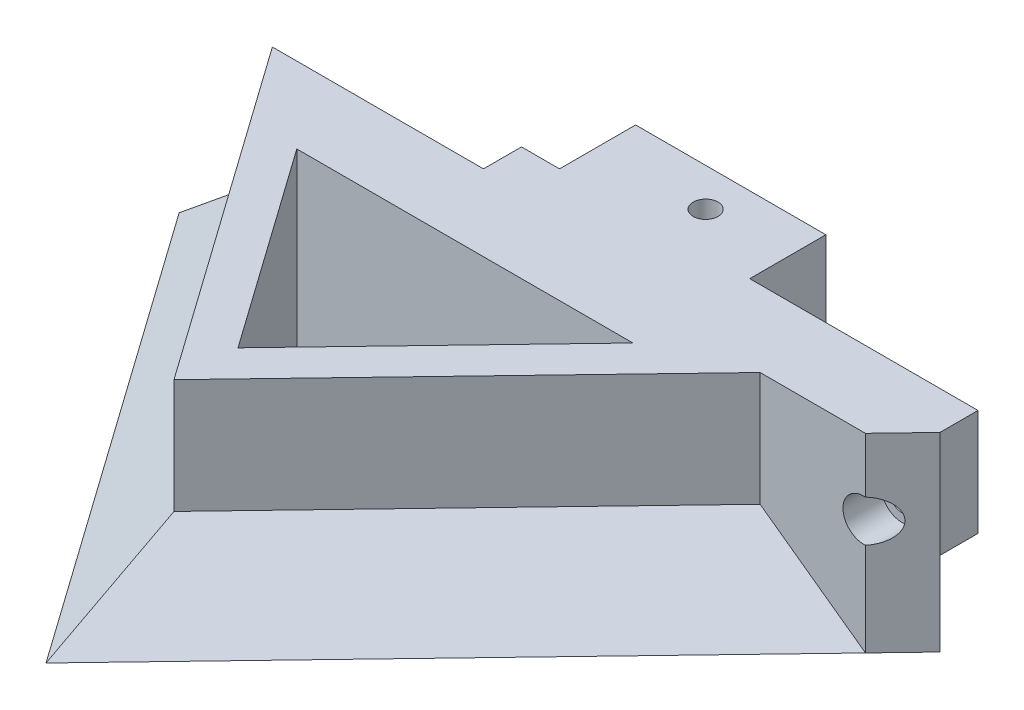
ISO-10303-21;
HEADER;
FILE_DESCRIPTION(('STEP AP214'),'2;1');
FILE_NAME('part.step','',(''),(''),'','','');
FILE_SCHEMA(('AUTOMOTIVE_DESIGN { 1 0 10303 214 1 1 1 1 }'));
ENDSEC;
DATA;
#1=APPLICATION_CONTEXT('core data for automotive mechanical design processes');
#2=APPLICATION_PROTOCOL_DEFINITION('international standard','automotive_design',2000,#1);
#3=PRODUCT_CONTEXT('',#1,'mechanical');
#4=PRODUCT('Part','Part','',(#3));
#5=PRODUCT_RELATED_PRODUCT_CATEGORY('part','',(#4));
#6=PRODUCT_DEFINITION_FORMATION('','',#4);
#7=PRODUCT_DEFINITION_CONTEXT('part definition',#1,'design');
#8=PRODUCT_DEFINITION('design','',#6,#7);
#9=PRODUCT_DEFINITION_SHAPE('','',#8);
#10=(LENGTH_UNIT() NAMED_UNIT(*) SI_UNIT(.MILLI.,.METRE.));
#11=(NAMED_UNIT(*) PLANE_ANGLE_UNIT() SI_UNIT($,.RADIAN.));
#12=(NAMED_UNIT(*) SI_UNIT($,.STERADIAN.) SOLID_ANGLE_UNIT());
#13=UNCERTAINTY_MEASURE_WITH_UNIT(LENGTH_MEASURE(1.E-05),#10,'distance_accuracy_value','');
#14=(GEOMETRIC_REPRESENTATION_CONTEXT(3) GLOBAL_UNCERTAINTY_ASSIGNED_CONTEXT((#13)) GLOBAL_UNIT_ASSIGNED_CONTEXT((#10,
#11,#12)) REPRESENTATION_CONTEXT('',''));
#15=CARTESIAN_POINT('',(0.,0.,0.));
#16=DIRECTION('',(0.,0.,1.));
#17=DIRECTION('',(1.,0.,0.));
#18=AXIS2_PLACEMENT_3D('',#15,#16,#17);
#19=CARTESIAN_POINT('',(-6.35,19.05,19.05));
#20=DIRECTION('',(0.,0.,-1.));
#21=DIRECTION('',(-1.,0.,0.));
#22=AXIS2_PLACEMENT_3D('',#19,#20,#21);
#23=CYLINDRICAL_SURFACE('',#22,3.4925);
#24=CARTESIAN_POINT('',(-6.35,19.05,6.35000000000001));
#25=DIRECTION('',(0.,0.,-1.));
#26=DIRECTION('',(-1.,0.,0.));
#27=AXIS2_PLACEMENT_3D('',#24,#25,#26);
#28=CIRCLE('',#27,3.4925);
#29=CARTESIAN_POINT('',(-6.08541666666669,15.5675365171014,6.35000000000001));
#30=VERTEX_POINT('',#29);
#31=CARTESIAN_POINT('',(-6.08541666666669,22.5324634828986,6.35000000000001));
#32=VERTEX_POINT('',#31);
#33=EDGE_CURVE('E43',#30,#32,#28,.T.);
#34=ORIENTED_EDGE('',*,*,#33,.F.);
#35=CARTESIAN_POINT('',(-6.35,19.05,6.62608695652175));
#36=DIRECTION('',(-0.721988205115424,0.,-0.691905363235615));
#37=DIRECTION('',(0.691905363235615,0.,-0.721988205115424));
#38=AXIS2_PLACEMENT_3D('',#35,#36,#37);
#39=ELLIPSE('',#38,5.04765562687321,3.4925);
#40=EDGE_CURVE('E57',#32,#30,#39,.T.);
#41=ORIENTED_EDGE('',*,*,#40,.F.);
#42=EDGE_LOOP('',(#34,#41));
#43=FACE_BOUND('',#42,.T.);
#44=CARTESIAN_POINT('',(-6.35,19.05,0.));
#45=DIRECTION('',(0.,0.,-1.));
#46=DIRECTION('',(-1.,0.,0.));
#47=AXIS2_PLACEMENT_3D('',#44,#45,#46);
#48=CIRCLE('',#47,3.4925);
#49=CARTESIAN_POINT('',(-9.84250000000001,19.05,0.));
#50=VERTEX_POINT('',#49);
#51=EDGE_CURVE('E11',#50,#50,#48,.F.);
#52=ORIENTED_EDGE('',*,*,#51,.F.);
#53=EDGE_LOOP('',(#52));
#54=FACE_BOUND('',#53,.T.);
#55=ADVANCED_FACE('F35',(#43,#54),#23,.F.);
#56=CARTESIAN_POINT('',(-51.816,31.75,-12.7));
#57=DIRECTION('',(0.,-1.,0.));
#58=DIRECTION('',(0.,0.,-1.));
#59=AXIS2_PLACEMENT_3D('',#56,#57,#58);
#60=CYLINDRICAL_SURFACE('',#59,2.0828);
#61=CARTESIAN_POINT('',(-51.816,31.75,-12.7));
#62=DIRECTION('',(0.,1.,0.));
#63=DIRECTION('',(0.,0.,1.));
#64=AXIS2_PLACEMENT_3D('',#61,#62,#63);
#65=CIRCLE('',#64,2.0828);
#66=CARTESIAN_POINT('',(-51.816,31.75,-10.6172));
#67=VERTEX_POINT('',#66);
#68=EDGE_CURVE('E268',#67,#67,#65,.T.);
#69=ORIENTED_EDGE('',*,*,#68,.T.);
#70=EDGE_LOOP('',(#69));
#71=FACE_BOUND('',#70,.T.);
#72=CARTESIAN_POINT('',(-51.816,25.4,-12.7));
#73=DIRECTION('',(0.,-1.,0.));
#74=DIRECTION('',(0.,0.,-1.));
#75=AXIS2_PLACEMENT_3D('',#72,#73,#74);
#76=CIRCLE('',#75,2.0828);
#77=CARTESIAN_POINT('',(-51.816,25.4,-14.7828));
#78=VERTEX_POINT('',#77);
#79=EDGE_CURVE('E230',#78,#78,#76,.T.);
#80=ORIENTED_EDGE('',*,*,#79,.T.);
#81=EDGE_LOOP('',(#80));
#82=FACE_BOUND('',#81,.T.);
#83=ADVANCED_FACE('F394',(#71,#82),#60,.F.);
#84=CARTESIAN_POINT('',(-38.1,31.75,-19.05));
#85=DIRECTION('',(-1.,0.,0.));
#86=DIRECTION('',(0.,0.,1.));
#87=AXIS2_PLACEMENT_3D('',#84,#85,#86);
#88=PLANE('',#87);
#89=DIRECTION('',(0.,0.,1.));
#90=VECTOR('',#89,1.);
#91=CARTESIAN_POINT('',(-38.1,19.05,-19.05));
#92=LINE('',#91,#90);
#93=CARTESIAN_POINT('',(-38.1,19.05,-19.05));
#94=VERTEX_POINT('',#93);
#95=CARTESIAN_POINT('',(-38.1,19.05,-6.35));
#96=VERTEX_POINT('',#95);
#97=EDGE_CURVE('E233',#94,#96,#92,.T.);
#98=ORIENTED_EDGE('',*,*,#97,.F.);
#99=DIRECTION('',(0.,-1.,0.));
#100=VECTOR('',#99,1.);
#101=CARTESIAN_POINT('',(-38.1,31.75,-19.05));
#102=LINE('',#101,#100);
#103=CARTESIAN_POINT('',(-38.1,31.75,-19.05));
#104=VERTEX_POINT('',#103);
#105=EDGE_CURVE('E220',#104,#94,#102,.T.);
#106=ORIENTED_EDGE('',*,*,#105,.F.);
#107=DIRECTION('',(0.,0.,-1.));
#108=VECTOR('',#107,1.);
#109=CARTESIAN_POINT('',(-38.1,31.75,-19.05));
#110=LINE('',#109,#108);
#111=CARTESIAN_POINT('',(-38.1,31.75,-6.35));
#112=VERTEX_POINT('',#111);
#113=EDGE_CURVE('E299',#112,#104,#110,.T.);
#114=ORIENTED_EDGE('',*,*,#113,.F.);
#115=DIRECTION('',(0.,-1.,0.));
#116=VECTOR('',#115,1.);
#117=CARTESIAN_POINT('',(-38.1,31.75,-6.35));
#118=LINE('',#117,#116);
#119=EDGE_CURVE('E223',#112,#96,#118,.T.);
#120=ORIENTED_EDGE('',*,*,#119,.T.);
#121=EDGE_LOOP('',(#98,#106,#114,#120));
#122=FACE_BOUND('',#121,.T.);
#123=ADVANCED_FACE('F399',(#122),#88,.F.);
#124=CARTESIAN_POINT('',(-69.85,31.75,-19.05));
#125=DIRECTION('',(0.,0.,1.));
#126=DIRECTION('',(1.,0.,0.));
#127=AXIS2_PLACEMENT_3D('',#124,#125,#126);
#128=PLANE('',#127);
#129=DIRECTION('',(1.,0.,0.));
#130=VECTOR('',#129,1.);
#131=CARTESIAN_POINT('',(-69.85,19.05,-19.05));
#132=LINE('',#131,#130);
#133=CARTESIAN_POINT('',(-69.85,19.05,-19.05));
#134=VERTEX_POINT('',#133);
#135=EDGE_CURVE('E266',#134,#94,#132,.T.);
#136=ORIENTED_EDGE('',*,*,#135,.F.);
#137=DIRECTION('',(0.,-1.,0.));
#138=VECTOR('',#137,1.);
#139=CARTESIAN_POINT('',(-69.85,31.75,-19.05));
#140=LINE('',#139,#138);
#141=CARTESIAN_POINT('',(-69.85,31.75,-19.05));
#142=VERTEX_POINT('',#141);
#143=EDGE_CURVE('E217',#142,#134,#140,.T.);
#144=ORIENTED_EDGE('',*,*,#143,.F.);
#145=DIRECTION('',(-1.,0.,0.));
#146=VECTOR('',#145,1.);
#147=CARTESIAN_POINT('',(-69.85,31.75,-19.05));
#148=LINE('',#147,#146);
#149=EDGE_CURVE('E301',#104,#142,#148,.T.);
#150=ORIENTED_EDGE('',*,*,#149,.F.);
#151=ORIENTED_EDGE('',*,*,#105,.T.);
#152=EDGE_LOOP('',(#136,#144,#150,#151));
#153=FACE_BOUND('',#152,.T.);
#154=ADVANCED_FACE('F451',(#153),#128,.F.);
#155=CARTESIAN_POINT('',(-69.85,31.75,-6.35));
#156=DIRECTION('',(1.,0.,0.));
#157=DIRECTION('',(0.,0.,-1.));
#158=AXIS2_PLACEMENT_3D('',#155,#156,#157);
#159=PLANE('',#158);
#160=DIRECTION('',(0.,0.,-1.));
#161=VECTOR('',#160,1.);
#162=CARTESIAN_POINT('',(-69.85,19.05,-6.35));
#163=LINE('',#162,#161);
#164=CARTESIAN_POINT('',(-69.85,19.05,-6.35));
#165=VERTEX_POINT('',#164);
#166=EDGE_CURVE('E264',#165,#134,#163,.T.);
#167=ORIENTED_EDGE('',*,*,#166,.F.);
#168=DIRECTION('',(0.,-1.,0.));
#169=VECTOR('',#168,1.);
#170=CARTESIAN_POINT('',(-69.85,31.75,-6.35));
#171=LINE('',#170,#169);
#172=CARTESIAN_POINT('',(-69.85,31.75,-6.35));
#173=VERTEX_POINT('',#172);
#174=EDGE_CURVE('E214',#173,#165,#171,.T.);
#175=ORIENTED_EDGE('',*,*,#174,.F.);
#176=DIRECTION('',(0.,0.,1.));
#177=VECTOR('',#176,1.);
#178=CARTESIAN_POINT('',(-69.85,31.75,-6.35));
#179=LINE('',#178,#177);
#180=EDGE_CURVE('E303',#142,#173,#179,.T.);
#181=ORIENTED_EDGE('',*,*,#180,.F.);
#182=ORIENTED_EDGE('',*,*,#143,.T.);
#183=EDGE_LOOP('',(#167,#175,#181,#182));
#184=FACE_BOUND('',#183,.T.);
#185=ADVANCED_FACE('F436',(#184),#159,.F.);
#186=CARTESIAN_POINT('',(0.,31.75,0.));
#187=DIRECTION('',(0.,-1.,0.));
#188=DIRECTION('',(0.,0.,-1.));
#189=AXIS2_PLACEMENT_3D('',#186,#187,#188);
#190=PLANE('',#189);
#191=DIRECTION('',(-1.,0.,0.));
#192=VECTOR('',#191,1.);
#193=CARTESIAN_POINT('',(-76.2,31.75,0.));
#194=LINE('',#193,#192);
#195=CARTESIAN_POINT('',(-76.2,31.75,0.));
#196=VERTEX_POINT('',#195);
#197=CARTESIAN_POINT('',(-111.436741428573,31.75,0.));
#198=VERTEX_POINT('',#197);
#199=EDGE_CURVE('E309',#196,#198,#194,.T.);
#200=ORIENTED_EDGE('',*,*,#199,.T.);
#201=DIRECTION('',(-0.578017340780339,0.,-0.816024481101655));
#202=VECTOR('',#201,1.);
#203=CARTESIAN_POINT('',(-71.5520102233513,31.75,56.3078558191359));
#204=LINE('',#203,#202);
#205=CARTESIAN_POINT('',(-71.5520102233513,31.75,56.3078558191359));
#206=VERTEX_POINT('',#205);
#207=EDGE_CURVE('E334',#206,#198,#204,.T.);
#208=ORIENTED_EDGE('',*,*,#207,.F.);
#209=DIRECTION('',(-0.691905363235615,0.,0.721988205115424));
#210=VECTOR('',#209,1.);
#211=CARTESIAN_POINT('',(-71.5520102233513,31.75,56.3078558191359));
#212=LINE('',#211,#210);
#213=CARTESIAN_POINT('',(-23.6757317300127,31.75,6.35));
#214=VERTEX_POINT('',#213);
#215=EDGE_CURVE('E338',#214,#206,#212,.T.);
#216=ORIENTED_EDGE('',*,*,#215,.F.);
#217=DIRECTION('',(-1.,0.,0.));
#218=VECTOR('',#217,1.);
#219=CARTESIAN_POINT('',(-23.6757317300127,31.75,6.35));
#220=LINE('',#219,#218);
#221=CARTESIAN_POINT('',(-6.08541666666669,31.75,6.35000000000001));
#222=VERTEX_POINT('',#221);
#223=EDGE_CURVE('E340',#222,#214,#220,.T.);
#224=ORIENTED_EDGE('',*,*,#223,.F.);
#225=DIRECTION('',(0.691905363235615,0.,-0.721988205115424));
#226=VECTOR('',#225,1.);
#227=CARTESIAN_POINT('',(-73.025,31.75,76.2));
#228=LINE('',#227,#226);
#229=CARTESIAN_POINT('',(0.,31.75,0.));
#230=VERTEX_POINT('',#229);
#231=EDGE_CURVE('E208',#222,#230,#228,.T.);
#232=ORIENTED_EDGE('',*,*,#231,.T.);
#233=DIRECTION('',(0.,0.,-1.));
#234=VECTOR('',#233,1.);
#235=CARTESIAN_POINT('',(0.,31.75,0.));
#236=LINE('',#235,#234);
#237=CARTESIAN_POINT('',(0.,31.75,-6.35));
#238=VERTEX_POINT('',#237);
#239=EDGE_CURVE('E199',#230,#238,#236,.T.);
#240=ORIENTED_EDGE('',*,*,#239,.T.);
#241=DIRECTION('',(-1.,0.,0.));
#242=VECTOR('',#241,1.);
#243=CARTESIAN_POINT('',(-38.1,31.75,-6.35));
#244=LINE('',#243,#242);
#245=EDGE_CURVE('E297',#238,#112,#244,.T.);
#246=ORIENTED_EDGE('',*,*,#245,.T.);
#247=ORIENTED_EDGE('',*,*,#113,.T.);
#248=ORIENTED_EDGE('',*,*,#149,.T.);
#249=ORIENTED_EDGE('',*,*,#180,.T.);
#250=DIRECTION('',(-1.,0.,0.));
#251=VECTOR('',#250,1.);
#252=CARTESIAN_POINT('',(-69.85,31.75,-6.35));
#253=LINE('',#252,#251);
#254=CARTESIAN_POINT('',(-76.2,31.75,-6.35));
#255=VERTEX_POINT('',#254);
#256=EDGE_CURVE('E305',#173,#255,#253,.T.);
#257=ORIENTED_EDGE('',*,*,#256,.T.);
#258=DIRECTION('',(0.,0.,1.));
#259=VECTOR('',#258,1.);
#260=CARTESIAN_POINT('',(-76.2,31.75,-6.35));
#261=LINE('',#260,#259);
#262=EDGE_CURVE('E307',#255,#196,#261,.T.);
#263=ORIENTED_EDGE('',*,*,#262,.T.);
#264=EDGE_LOOP('',(#200,#208,#216,#224,#232,#240,#246,#247,#248,#249,#257,#263));
#265=FACE_BOUND('',#264,.T.);
#266=DIRECTION('',(0.578017340780339,0.,0.816024481101655));
#267=VECTOR('',#266,1.);
#268=CARTESIAN_POINT('',(-94.6592788095254,31.75,12.7));
#269=LINE('',#268,#267);
#270=CARTESIAN_POINT('',(-94.6592788095254,31.75,12.7));
#271=VERTEX_POINT('',#270);
#272=CARTESIAN_POINT('',(-70.8155153350269,31.75,46.3617837287039));
#273=VERTEX_POINT('',#272);
#274=EDGE_CURVE('E274',#271,#273,#269,.T.);
#275=ORIENTED_EDGE('',*,*,#274,.F.);
#276=DIRECTION('',(-1.,0.,0.));
#277=VECTOR('',#276,1.);
#278=CARTESIAN_POINT('',(-76.2,31.75,12.7));
#279=LINE('',#278,#277);
#280=CARTESIAN_POINT('',(-38.5563059283524,31.75,12.7));
#281=VERTEX_POINT('',#280);
#282=EDGE_CURVE('E272',#281,#271,#279,.T.);
#283=ORIENTED_EDGE('',*,*,#282,.F.);
#284=DIRECTION('',(0.691905363235615,0.,-0.721988205115424));
#285=VECTOR('',#284,1.);
#286=CARTESIAN_POINT('',(-70.8155153350269,31.75,46.3617837287039));
#287=LINE('',#286,#285);
#288=EDGE_CURVE('E277',#273,#281,#287,.T.);
#289=ORIENTED_EDGE('',*,*,#288,.F.);
#290=EDGE_LOOP('',(#275,#283,#289));
#291=FACE_BOUND('',#290,.T.);
#292=ORIENTED_EDGE('',*,*,#68,.F.);
#293=EDGE_LOOP('',(#292));
#294=FACE_BOUND('',#293,.T.);
#295=ADVANCED_FACE('F376',(#265,#291,#294),#190,.F.);
#296=CARTESIAN_POINT('',(0.,0.,0.));
#297=DIRECTION('',(0.,-1.,0.));
#298=DIRECTION('',(0.,0.,-1.));
#299=AXIS2_PLACEMENT_3D('',#296,#297,#298);
#300=PLANE('',#299);
#301=DIRECTION('',(0.,0.,-1.));
#302=VECTOR('',#301,1.);
#303=CARTESIAN_POINT('',(-11.43,0.,0.));
#304=LINE('',#303,#302);
#305=CARTESIAN_POINT('',(-11.43,0.,0.));
#306=VERTEX_POINT('',#305);
#307=CARTESIAN_POINT('',(-11.43,0.,-6.35000000000001));
#308=VERTEX_POINT('',#307);
#309=EDGE_CURVE('E188',#306,#308,#304,.T.);
#310=ORIENTED_EDGE('',*,*,#309,.F.);
#311=DIRECTION('',(-1.,0.,0.));
#312=VECTOR('',#311,1.);
#313=CARTESIAN_POINT('',(0.,0.,0.));
#314=LINE('',#313,#312);
#315=CARTESIAN_POINT('',(0.,0.,0.));
#316=VERTEX_POINT('',#315);
#317=EDGE_CURVE('E172',#316,#306,#314,.T.);
#318=ORIENTED_EDGE('',*,*,#317,.F.);
#319=DIRECTION('',(0.691905363235615,0.,-0.721988205115424));
#320=VECTOR('',#319,1.);
#321=CARTESIAN_POINT('',(-73.025,0.,76.2));
#322=LINE('',#321,#320);
#323=CARTESIAN_POINT('',(-6.0854166666667,0.,6.35000000000005));
#324=VERTEX_POINT('',#323);
#325=EDGE_CURVE('E185',#324,#316,#322,.T.);
#326=ORIENTED_EDGE('',*,*,#325,.F.);
#327=CARTESIAN_POINT('',(-73.025,0.,76.2));
#328=VERTEX_POINT('',#327);
#329=EDGE_CURVE('E196',#328,#324,#322,.T.);
#330=ORIENTED_EDGE('',*,*,#329,.F.);
#331=DIRECTION('',(0.578017340780339,0.,0.816024481101655));
#332=VECTOR('',#331,1.);
#333=CARTESIAN_POINT('',(-127.,0.,0.));
#334=LINE('',#333,#332);
#335=CARTESIAN_POINT('',(-127.,0.,0.));
#336=VERTEX_POINT('',#335);
#337=EDGE_CURVE('E197',#336,#328,#334,.T.);
#338=ORIENTED_EDGE('',*,*,#337,.F.);
#339=DIRECTION('',(-1.,0.,0.));
#340=VECTOR('',#339,1.);
#341=CARTESIAN_POINT('',(-76.2,0.,0.));
#342=LINE('',#341,#340);
#343=CARTESIAN_POINT('',(-76.2,0.,0.));
#344=VERTEX_POINT('',#343);
#345=EDGE_CURVE('E201',#344,#336,#342,.T.);
#346=ORIENTED_EDGE('',*,*,#345,.F.);
#347=DIRECTION('',(0.,0.,1.));
#348=VECTOR('',#347,1.);
#349=CARTESIAN_POINT('',(-76.2,0.,-6.35));
#350=LINE('',#349,#348);
#351=CARTESIAN_POINT('',(-76.2,0.,-6.35));
#352=VERTEX_POINT('',#351);
#353=EDGE_CURVE('E314',#352,#344,#350,.T.);
#354=ORIENTED_EDGE('',*,*,#353,.F.);
#355=DIRECTION('',(-1.,0.,0.));
#356=VECTOR('',#355,1.);
#357=CARTESIAN_POINT('',(-69.85,0.,-6.35));
#358=LINE('',#357,#356);
#359=EDGE_CURVE('E294',#308,#352,#358,.T.);
#360=ORIENTED_EDGE('',*,*,#359,.F.);
#361=EDGE_LOOP('',(#310,#318,#326,#330,#338,#346,#354,#360));
#362=FACE_BOUND('',#361,.T.);
#363=DIRECTION('',(-1.,0.,0.));
#364=VECTOR('',#363,1.);
#365=CARTESIAN_POINT('',(-38.5563059283524,0.,12.7));
#366=LINE('',#365,#364);
#367=CARTESIAN_POINT('',(-38.5563059283524,0.,12.7));
#368=VERTEX_POINT('',#367);
#369=CARTESIAN_POINT('',(-94.6592788095254,0.,12.7));
#370=VERTEX_POINT('',#369);
#371=EDGE_CURVE('E275',#368,#370,#366,.T.);
#372=ORIENTED_EDGE('',*,*,#371,.T.);
#373=DIRECTION('',(0.578017340780339,0.,0.816024481101655));
#374=VECTOR('',#373,1.);
#375=CARTESIAN_POINT('',(-94.6592788095254,0.,12.7));
#376=LINE('',#375,#374);
#377=CARTESIAN_POINT('',(-70.8155153350269,0.,46.3617837287039));
#378=VERTEX_POINT('',#377);
#379=EDGE_CURVE('E271',#370,#378,#376,.T.);
#380=ORIENTED_EDGE('',*,*,#379,.T.);
#381=DIRECTION('',(0.691905363235615,0.,-0.721988205115424));
#382=VECTOR('',#381,1.);
#383=CARTESIAN_POINT('',(-70.8155153350269,0.,46.3617837287039));
#384=LINE('',#383,#382);
#385=EDGE_CURVE('E283',#378,#368,#384,.T.);
#386=ORIENTED_EDGE('',*,*,#385,.T.);
#387=EDGE_LOOP('',(#372,#380,#386));
#388=FACE_BOUND('',#387,.T.);
#389=ADVANCED_FACE('F182',(#362,#388),#300,.T.);
#390=CARTESIAN_POINT('',(0.,31.75,0.));
#391=DIRECTION('',(-1.,0.,0.));
#392=DIRECTION('',(0.,0.,1.));
#393=AXIS2_PLACEMENT_3D('',#390,#391,#392);
#394=PLANE('',#393);
#395=DIRECTION('',(0.,-1.,0.));
#396=VECTOR('',#395,1.);
#397=CARTESIAN_POINT('',(0.,31.75,0.));
#398=LINE('',#397,#396);
#399=CARTESIAN_POINT('',(0.,13.97,0.));
#400=VERTEX_POINT('',#399);
#401=EDGE_CURVE('E205',#230,#400,#398,.T.);
#402=ORIENTED_EDGE('',*,*,#401,.T.);
#403=DIRECTION('',(0.,0.,-1.));
#404=VECTOR('',#403,1.);
#405=CARTESIAN_POINT('',(0.,13.97,0.));
#406=LINE('',#405,#404);
#407=CARTESIAN_POINT('',(0.,13.97,-6.35000000000001));
#408=VERTEX_POINT('',#407);
#409=EDGE_CURVE('E348',#400,#408,#406,.T.);
#410=ORIENTED_EDGE('',*,*,#409,.T.);
#411=DIRECTION('',(0.,-1.,0.));
#412=VECTOR('',#411,1.);
#413=CARTESIAN_POINT('',(0.,31.75,-6.35));
#414=LINE('',#413,#412);
#415=EDGE_CURVE('E226',#238,#408,#414,.T.);
#416=ORIENTED_EDGE('',*,*,#415,.F.);
#417=ORIENTED_EDGE('',*,*,#239,.F.);
#418=EDGE_LOOP('',(#402,#410,#416,#417));
#419=FACE_BOUND('',#418,.T.);
#420=ADVANCED_FACE('F367',(#419),#394,.F.);
#421=CARTESIAN_POINT('',(-69.85,31.75,-6.35));
#422=DIRECTION('',(0.,0.,1.));
#423=DIRECTION('',(1.,0.,0.));
#424=AXIS2_PLACEMENT_3D('',#421,#422,#423);
#425=PLANE('',#424);
#426=ORIENTED_EDGE('',*,*,#415,.T.);
#427=DIRECTION('',(1.,0.,0.));
#428=VECTOR('',#427,1.);
#429=CARTESIAN_POINT('',(-11.43,13.97,-6.35000000000001));
#430=LINE('',#429,#428);
#431=CARTESIAN_POINT('',(-11.43,13.97,-6.35000000000001));
#432=VERTEX_POINT('',#431);
#433=EDGE_CURVE('E178',#432,#408,#430,.T.);
#434=ORIENTED_EDGE('',*,*,#433,.F.);
#435=DIRECTION('',(0.,1.,0.));
#436=VECTOR('',#435,1.);
#437=CARTESIAN_POINT('',(-11.43,0.,-6.35000000000001));
#438=LINE('',#437,#436);
#439=EDGE_CURVE('E357',#308,#432,#438,.T.);
#440=ORIENTED_EDGE('',*,*,#439,.F.);
#441=ORIENTED_EDGE('',*,*,#359,.T.);
#442=DIRECTION('',(0.,-1.,0.));
#443=VECTOR('',#442,1.);
#444=CARTESIAN_POINT('',(-76.2,31.75,-6.35));
#445=LINE('',#444,#443);
#446=EDGE_CURVE('E211',#255,#352,#445,.T.);
#447=ORIENTED_EDGE('',*,*,#446,.F.);
#448=ORIENTED_EDGE('',*,*,#256,.F.);
#449=ORIENTED_EDGE('',*,*,#174,.T.);
#450=DIRECTION('',(-1.,0.,0.));
#451=VECTOR('',#450,1.);
#452=CARTESIAN_POINT('',(-38.1,19.05,-6.35));
#453=LINE('',#452,#451);
#454=EDGE_CURVE('E262',#96,#165,#453,.T.);
#455=ORIENTED_EDGE('',*,*,#454,.F.);
#456=ORIENTED_EDGE('',*,*,#119,.F.);
#457=ORIENTED_EDGE('',*,*,#245,.F.);
#458=EDGE_LOOP('',(#426,#434,#440,#441,#447,#448,#449,#455,#456,#457));
#459=FACE_BOUND('',#458,.T.);
#460=CARTESIAN_POINT('',(-6.35,19.05,-6.35000000000001));
#461=DIRECTION('',(0.,0.,-1.));
#462=DIRECTION('',(-1.,0.,0.));
#463=AXIS2_PLACEMENT_3D('',#460,#461,#462);
#464=CIRCLE('',#463,2.0828);
#465=CARTESIAN_POINT('',(-8.43280000000001,19.05,-6.35000000000001));
#466=VERTEX_POINT('',#465);
#467=EDGE_CURVE('E345',#466,#466,#464,.T.);
#468=ORIENTED_EDGE('',*,*,#467,.F.);
#469=EDGE_LOOP('',(#468));
#470=FACE_BOUND('',#469,.T.);
#471=ADVANCED_FACE('F370',(#459,#470),#425,.F.);
#472=CARTESIAN_POINT('',(-76.2,31.75,-6.35));
#473=DIRECTION('',(1.,0.,0.));
#474=DIRECTION('',(0.,0.,-1.));
#475=AXIS2_PLACEMENT_3D('',#472,#473,#474);
#476=PLANE('',#475);
#477=ORIENTED_EDGE('',*,*,#353,.T.);
#478=DIRECTION('',(0.,-1.,0.));
#479=VECTOR('',#478,1.);
#480=CARTESIAN_POINT('',(-76.2,31.75,0.));
#481=LINE('',#480,#479);
#482=EDGE_CURVE('E207',#196,#344,#481,.T.);
#483=ORIENTED_EDGE('',*,*,#482,.F.);
#484=ORIENTED_EDGE('',*,*,#262,.F.);
#485=ORIENTED_EDGE('',*,*,#446,.T.);
#486=EDGE_LOOP('',(#477,#483,#484,#485));
#487=FACE_BOUND('',#486,.T.);
#488=ADVANCED_FACE('F443',(#487),#476,.F.);
#489=CARTESIAN_POINT('',(-76.2,31.75,0.));
#490=DIRECTION('',(0.,0.,1.));
#491=DIRECTION('',(1.,0.,0.));
#492=AXIS2_PLACEMENT_3D('',#489,#490,#491);
#493=PLANE('',#492);
#494=ORIENTED_EDGE('',*,*,#345,.T.);
#495=DIRECTION('',(0.774775828875946,0.632236043728599,0.));
#496=VECTOR('',#495,1.);
#497=CARTESIAN_POINT('',(-89.0875268047992,30.9375062663942,0.));
#498=LINE('',#497,#496);
#499=CARTESIAN_POINT('',(-111.436741428573,12.7,0.));
#500=VERTEX_POINT('',#499);
#501=EDGE_CURVE('E238',#336,#500,#498,.T.);
#502=ORIENTED_EDGE('',*,*,#501,.T.);
#503=DIRECTION('',(0.,1.,0.));
#504=VECTOR('',#503,1.);
#505=CARTESIAN_POINT('',(-111.436741428573,12.7,0.));
#506=LINE('',#505,#504);
#507=EDGE_CURVE('E259',#500,#198,#506,.T.);
#508=ORIENTED_EDGE('',*,*,#507,.T.);
#509=ORIENTED_EDGE('',*,*,#199,.F.);
#510=ORIENTED_EDGE('',*,*,#482,.T.);
#511=EDGE_LOOP('',(#494,#502,#508,#509,#510));
#512=FACE_BOUND('',#511,.T.);
#513=ADVANCED_FACE('F318',(#512),#493,.F.);
#514=CARTESIAN_POINT('',(-73.025,31.75,76.2));
#515=DIRECTION('',(-0.721988205115424,0.,-0.691905363235615));
#516=DIRECTION('',(-0.691905363235615,0.,0.721988205115424));
#517=AXIS2_PLACEMENT_3D('',#514,#515,#516);
#518=PLANE('',#517);
#519=DIRECTION('',(0.,1.,0.));
#520=VECTOR('',#519,1.);
#521=CARTESIAN_POINT('',(-6.08541666666669,12.7,6.35000000000001));
#522=LINE('',#521,#520);
#523=EDGE_CURVE('E242',#32,#222,#522,.T.);
#524=ORIENTED_EDGE('',*,*,#523,.F.);
#525=ORIENTED_EDGE('',*,*,#40,.T.);
#526=EDGE_CURVE('E194',#324,#30,#522,.T.);
#527=ORIENTED_EDGE('',*,*,#526,.F.);
#528=ORIENTED_EDGE('',*,*,#325,.T.);
#529=DIRECTION('',(0.,-1.,0.));
#530=VECTOR('',#529,1.);
#531=CARTESIAN_POINT('',(0.,13.97,0.));
#532=LINE('',#531,#530);
#533=EDGE_CURVE('E169',#400,#316,#532,.T.);
#534=ORIENTED_EDGE('',*,*,#533,.F.);
#535=ORIENTED_EDGE('',*,*,#401,.F.);
#536=ORIENTED_EDGE('',*,*,#231,.F.);
#537=EDGE_LOOP('',(#524,#525,#527,#528,#534,#535,#536));
#538=FACE_BOUND('',#537,.T.);
#539=ADVANCED_FACE('F192',(#538),#518,.F.);
#540=CARTESIAN_POINT('',(-94.6592788095254,31.75,12.7));
#541=DIRECTION('',(0.816024481101655,0.,-0.578017340780339));
#542=DIRECTION('',(-0.578017340780339,0.,-0.816024481101655));
#543=AXIS2_PLACEMENT_3D('',#540,#541,#542);
#544=PLANE('',#543);
#545=ORIENTED_EDGE('',*,*,#379,.F.);
#546=DIRECTION('',(0.,-1.,0.));
#547=VECTOR('',#546,1.);
#548=CARTESIAN_POINT('',(-94.6592788095254,31.75,12.7));
#549=LINE('',#548,#547);
#550=EDGE_CURVE('E291',#271,#370,#549,.T.);
#551=ORIENTED_EDGE('',*,*,#550,.F.);
#552=ORIENTED_EDGE('',*,*,#274,.T.);
#553=DIRECTION('',(0.,-1.,0.));
#554=VECTOR('',#553,1.);
#555=CARTESIAN_POINT('',(-70.8155153350269,31.75,46.3617837287039));
#556=LINE('',#555,#554);
#557=EDGE_CURVE('E289',#273,#378,#556,.T.);
#558=ORIENTED_EDGE('',*,*,#557,.T.);
#559=EDGE_LOOP('',(#545,#551,#552,#558));
#560=FACE_BOUND('',#559,.T.);
#561=ADVANCED_FACE('F429',(#560),#544,.T.);
#562=CARTESIAN_POINT('',(-70.8155153350269,31.75,46.3617837287039));
#563=DIRECTION('',(-0.721988205115424,0.,-0.691905363235615));
#564=DIRECTION('',(-0.691905363235615,0.,0.721988205115424));
#565=AXIS2_PLACEMENT_3D('',#562,#563,#564);
#566=PLANE('',#565);
#567=ORIENTED_EDGE('',*,*,#385,.F.);
#568=ORIENTED_EDGE('',*,*,#557,.F.);
#569=ORIENTED_EDGE('',*,*,#288,.T.);
#570=DIRECTION('',(0.,-1.,0.));
#571=VECTOR('',#570,1.);
#572=CARTESIAN_POINT('',(-38.5563059283524,31.75,12.7));
#573=LINE('',#572,#571);
#574=EDGE_CURVE('E280',#281,#368,#573,.T.);
#575=ORIENTED_EDGE('',*,*,#574,.T.);
#576=EDGE_LOOP('',(#567,#568,#569,#575));
#577=FACE_BOUND('',#576,.T.);
#578=ADVANCED_FACE('F425',(#577),#566,.T.);
#579=CARTESIAN_POINT('',(-38.5563059283524,31.75,12.7));
#580=DIRECTION('',(0.,0.,1.));
#581=DIRECTION('',(1.,0.,0.));
#582=AXIS2_PLACEMENT_3D('',#579,#580,#581);
#583=PLANE('',#582);
#584=ORIENTED_EDGE('',*,*,#371,.F.);
#585=ORIENTED_EDGE('',*,*,#574,.F.);
#586=ORIENTED_EDGE('',*,*,#282,.T.);
#587=ORIENTED_EDGE('',*,*,#550,.T.);
#588=EDGE_LOOP('',(#584,#585,#586,#587));
#589=FACE_BOUND('',#588,.T.);
#590=ADVANCED_FACE('F420',(#589),#583,.T.);
#591=CARTESIAN_POINT('',(0.,19.05,0.));
#592=DIRECTION('',(0.,-1.,0.));
#593=DIRECTION('',(0.,0.,-1.));
#594=AXIS2_PLACEMENT_3D('',#591,#592,#593);
#595=PLANE('',#594);
#596=CARTESIAN_POINT('',(-51.816,19.05,-12.7));
#597=DIRECTION('',(0.,-1.,0.));
#598=DIRECTION('',(0.,0.,-1.));
#599=AXIS2_PLACEMENT_3D('',#596,#597,#598);
#600=CIRCLE('',#599,3.4925);
#601=CARTESIAN_POINT('',(-51.816,19.05,-16.1925));
#602=VERTEX_POINT('',#601);
#603=EDGE_CURVE('E256',#602,#602,#600,.T.);
#604=ORIENTED_EDGE('',*,*,#603,.F.);
#605=EDGE_LOOP('',(#604));
#606=FACE_BOUND('',#605,.T.);
#607=ORIENTED_EDGE('',*,*,#97,.T.);
#608=ORIENTED_EDGE('',*,*,#454,.T.);
#609=ORIENTED_EDGE('',*,*,#166,.T.);
#610=ORIENTED_EDGE('',*,*,#135,.T.);
#611=EDGE_LOOP('',(#607,#608,#609,#610));
#612=FACE_BOUND('',#611,.T.);
#613=ADVANCED_FACE('F417',(#606,#612),#595,.T.);
#614=CARTESIAN_POINT('',(-51.816,25.4,-12.7));
#615=DIRECTION('',(0.,-1.,0.));
#616=DIRECTION('',(0.,0.,-1.));
#617=AXIS2_PLACEMENT_3D('',#614,#615,#616);
#618=CYLINDRICAL_SURFACE('',#617,3.4925);
#619=CARTESIAN_POINT('',(-51.816,25.4,-12.7));
#620=DIRECTION('',(0.,-1.,0.));
#621=DIRECTION('',(0.,0.,-1.));
#622=AXIS2_PLACEMENT_3D('',#619,#620,#621);
#623=CIRCLE('',#622,3.4925);
#624=CARTESIAN_POINT('',(-51.816,25.4,-16.1925));
#625=VERTEX_POINT('',#624);
#626=EDGE_CURVE('E234',#625,#625,#623,.T.);
#627=ORIENTED_EDGE('',*,*,#626,.F.);
#628=EDGE_LOOP('',(#627));
#629=FACE_BOUND('',#628,.T.);
#630=ORIENTED_EDGE('',*,*,#603,.T.);
#631=EDGE_LOOP('',(#630));
#632=FACE_BOUND('',#631,.T.);
#633=ADVANCED_FACE('F413',(#629,#632),#618,.F.);
#634=CARTESIAN_POINT('',(-51.816,25.4,-12.7));
#635=DIRECTION('',(0.,-1.,0.));
#636=DIRECTION('',(0.,0.,-1.));
#637=AXIS2_PLACEMENT_3D('',#634,#635,#636);
#638=PLANE('',#637);
#639=ORIENTED_EDGE('',*,*,#79,.F.);
#640=EDGE_LOOP('',(#639));
#641=FACE_BOUND('',#640,.T.);
#642=ORIENTED_EDGE('',*,*,#626,.T.);
#643=EDGE_LOOP('',(#642));
#644=FACE_BOUND('',#643,.T.);
#645=ADVANCED_FACE('F408',(#641,#644),#638,.T.);
#646=CARTESIAN_POINT('',(-71.5520102233513,12.7,56.3078558191359));
#647=DIRECTION('',(0.816024481101655,0.,-0.578017340780339));
#648=DIRECTION('',(-0.578017340780339,0.,-0.816024481101655));
#649=AXIS2_PLACEMENT_3D('',#646,#647,#648);
#650=PLANE('',#649);
#651=ORIENTED_EDGE('',*,*,#207,.T.);
#652=ORIENTED_EDGE('',*,*,#507,.F.);
#653=DIRECTION('',(-0.578017340780339,0.,-0.816024481101655));
#654=VECTOR('',#653,1.);
#655=CARTESIAN_POINT('',(-71.5520102233513,12.7,56.3078558191359));
#656=LINE('',#655,#654);
#657=CARTESIAN_POINT('',(-71.5520102233513,12.7,56.3078558191359));
#658=VERTEX_POINT('',#657);
#659=EDGE_CURVE('E245',#658,#500,#656,.T.);
#660=ORIENTED_EDGE('',*,*,#659,.F.);
#661=DIRECTION('',(0.,1.,0.));
#662=VECTOR('',#661,1.);
#663=CARTESIAN_POINT('',(-71.5520102233513,12.7,56.3078558191359));
#664=LINE('',#663,#662);
#665=EDGE_CURVE('E331',#658,#206,#664,.T.);
#666=ORIENTED_EDGE('',*,*,#665,.T.);
#667=EDGE_LOOP('',(#651,#652,#660,#666));
#668=FACE_BOUND('',#667,.T.);
#669=ADVANCED_FACE('F329',(#668),#650,.F.);
#670=CARTESIAN_POINT('',(-71.5520102233513,12.7,56.3078558191359));
#671=DIRECTION('',(-0.721988205115424,0.,-0.691905363235615));
#672=DIRECTION('',(-0.691905363235615,0.,0.721988205115424));
#673=AXIS2_PLACEMENT_3D('',#670,#671,#672);
#674=PLANE('',#673);
#675=ORIENTED_EDGE('',*,*,#215,.T.);
#676=ORIENTED_EDGE('',*,*,#665,.F.);
#677=DIRECTION('',(-0.691905363235615,0.,0.721988205115424));
#678=VECTOR('',#677,1.);
#679=CARTESIAN_POINT('',(-71.5520102233513,12.7,56.3078558191359));
#680=LINE('',#679,#678);
#681=CARTESIAN_POINT('',(-23.6757317300127,12.7,6.35));
#682=VERTEX_POINT('',#681);
#683=EDGE_CURVE('E249',#682,#658,#680,.T.);
#684=ORIENTED_EDGE('',*,*,#683,.F.);
#685=DIRECTION('',(0.,1.,0.));
#686=VECTOR('',#685,1.);
#687=CARTESIAN_POINT('',(-23.6757317300127,12.7,6.35));
#688=LINE('',#687,#686);
#689=EDGE_CURVE('E247',#682,#214,#688,.T.);
#690=ORIENTED_EDGE('',*,*,#689,.T.);
#691=EDGE_LOOP('',(#675,#676,#684,#690));
#692=FACE_BOUND('',#691,.T.);
#693=ADVANCED_FACE('F382',(#692),#674,.F.);
#694=CARTESIAN_POINT('',(-23.6757317300127,12.7,6.35));
#695=DIRECTION('',(0.,0.,-1.));
#696=DIRECTION('',(-1.,0.,0.));
#697=AXIS2_PLACEMENT_3D('',#694,#695,#696);
#698=PLANE('',#697);
#699=ORIENTED_EDGE('',*,*,#526,.T.);
#700=ORIENTED_EDGE('',*,*,#33,.T.);
#701=ORIENTED_EDGE('',*,*,#523,.T.);
#702=ORIENTED_EDGE('',*,*,#223,.T.);
#703=ORIENTED_EDGE('',*,*,#689,.F.);
#704=DIRECTION('',(0.810769275053397,-0.585365853658538,0.));
#705=VECTOR('',#704,1.);
#706=CARTESIAN_POINT('',(-23.6757317300127,12.7,6.35));
#707=LINE('',#706,#705);
#708=EDGE_CURVE('E229',#682,#324,#707,.T.);
#709=ORIENTED_EDGE('',*,*,#708,.T.);
#710=EDGE_LOOP('',(#699,#700,#701,#702,#703,#709));
#711=FACE_BOUND('',#710,.T.);
#712=ADVANCED_FACE('F240',(#711),#698,.F.);
#713=CARTESIAN_POINT('',(-9.16925020496588,12.7,-8.78719811309229));
#714=DIRECTION('',(0.510522755773821,0.707106781186547,0.489250974283245));
#715=DIRECTION('',(-0.691905363235615,0.,0.721988205115424));
#716=AXIS2_PLACEMENT_3D('',#713,#714,#715);
#717=PLANE('',#716);
#718=ORIENTED_EDGE('',*,*,#683,.T.);
#719=DIRECTION('',(-0.0622920769050634,-0.537077303071436,0.841229854249341));
#720=VECTOR('',#719,1.);
#721=CARTESIAN_POINT('',(-67.8988381498831,44.1973573262676,6.97321225611932));
#722=LINE('',#721,#720);
#723=EDGE_CURVE('E236',#658,#328,#722,.T.);
#724=ORIENTED_EDGE('',*,*,#723,.T.);
#725=ORIENTED_EDGE('',*,*,#329,.T.);
#726=ORIENTED_EDGE('',*,*,#708,.F.);
#727=EDGE_LOOP('',(#718,#724,#725,#726));
#728=FACE_BOUND('',#727,.T.);
#729=ADVANCED_FACE('F384',(#728),#717,.T.);
#730=CARTESIAN_POINT('',(-74.2052752171766,12.7,52.5620699455001));
#731=DIRECTION('',(-0.577016444201214,0.707106781186547,0.408719981309194));
#732=DIRECTION('',(-0.578017340780339,0.,-0.816024481101655));
#733=AXIS2_PLACEMENT_3D('',#730,#731,#732);
#734=PLANE('',#733);
#735=ORIENTED_EDGE('',*,*,#501,.F.);
#736=ORIENTED_EDGE('',*,*,#337,.T.);
#737=ORIENTED_EDGE('',*,*,#723,.F.);
#738=ORIENTED_EDGE('',*,*,#659,.T.);
#739=EDGE_LOOP('',(#735,#736,#737,#738));
#740=FACE_BOUND('',#739,.T.);
#741=ADVANCED_FACE('F37',(#740),#734,.T.);
#742=CARTESIAN_POINT('',(-6.35,19.05,0.));
#743=DIRECTION('',(0.,0.,-1.));
#744=DIRECTION('',(-1.,0.,0.));
#745=AXIS2_PLACEMENT_3D('',#742,#743,#744);
#746=PLANE('',#745);
#747=CARTESIAN_POINT('',(-6.35,19.05,0.));
#748=DIRECTION('',(0.,0.,-1.));
#749=DIRECTION('',(-1.,0.,0.));
#750=AXIS2_PLACEMENT_3D('',#747,#748,#749);
#751=CIRCLE('',#750,2.0828);
#752=CARTESIAN_POINT('',(-8.4328,19.05,0.));
#753=VERTEX_POINT('',#752);
#754=EDGE_CURVE('E344',#753,#753,#751,.T.);
#755=ORIENTED_EDGE('',*,*,#754,.T.);
#756=EDGE_LOOP('',(#755));
#757=FACE_BOUND('',#756,.T.);
#758=ORIENTED_EDGE('',*,*,#51,.T.);
#759=EDGE_LOOP('',(#758));
#760=FACE_BOUND('',#759,.T.);
#761=ADVANCED_FACE('F390',(#757,#760),#746,.F.);
#762=CARTESIAN_POINT('',(-6.35,19.05,0.));
#763=DIRECTION('',(0.,0.,-1.));
#764=DIRECTION('',(-1.,0.,0.));
#765=AXIS2_PLACEMENT_3D('',#762,#763,#764);
#766=CYLINDRICAL_SURFACE('',#765,2.0828);
#767=ORIENTED_EDGE('',*,*,#754,.F.);
#768=EDGE_LOOP('',(#767));
#769=FACE_BOUND('',#768,.T.);
#770=ORIENTED_EDGE('',*,*,#467,.T.);
#771=EDGE_LOOP('',(#770));
#772=FACE_BOUND('',#771,.T.);
#773=ADVANCED_FACE('F536',(#769,#772),#766,.F.);
#774=CARTESIAN_POINT('',(-11.43,13.97,0.));
#775=DIRECTION('',(0.,1.,0.));
#776=DIRECTION('',(-1.,0.,0.));
#777=AXIS2_PLACEMENT_3D('',#774,#775,#776);
#778=PLANE('',#777);
#779=ORIENTED_EDGE('',*,*,#433,.T.);
#780=ORIENTED_EDGE('',*,*,#409,.F.);
#781=DIRECTION('',(1.,0.,0.));
#782=VECTOR('',#781,1.);
#783=CARTESIAN_POINT('',(-11.43,13.97,0.));
#784=LINE('',#783,#782);
#785=CARTESIAN_POINT('',(-11.43,13.97,0.));
#786=VERTEX_POINT('',#785);
#787=EDGE_CURVE('E50',#786,#400,#784,.T.);
#788=ORIENTED_EDGE('',*,*,#787,.F.);
#789=DIRECTION('',(0.,0.,-1.));
#790=VECTOR('',#789,1.);
#791=CARTESIAN_POINT('',(-11.43,13.97,0.));
#792=LINE('',#791,#790);
#793=EDGE_CURVE('E352',#786,#432,#792,.T.);
#794=ORIENTED_EDGE('',*,*,#793,.T.);
#795=EDGE_LOOP('',(#779,#780,#788,#794));
#796=FACE_BOUND('',#795,.T.);
#797=ADVANCED_FACE('F363',(#796),#778,.F.);
#798=CARTESIAN_POINT('',(-11.43,0.,0.));
#799=DIRECTION('',(-1.,0.,0.));
#800=DIRECTION('',(0.,0.,1.));
#801=AXIS2_PLACEMENT_3D('',#798,#799,#800);
#802=PLANE('',#801);
#803=ORIENTED_EDGE('',*,*,#439,.T.);
#804=ORIENTED_EDGE('',*,*,#793,.F.);
#805=DIRECTION('',(0.,1.,0.));
#806=VECTOR('',#805,1.);
#807=CARTESIAN_POINT('',(-11.43,0.,0.));
#808=LINE('',#807,#806);
#809=EDGE_CURVE('E189',#306,#786,#808,.T.);
#810=ORIENTED_EDGE('',*,*,#809,.F.);
#811=ORIENTED_EDGE('',*,*,#309,.T.);
#812=EDGE_LOOP('',(#803,#804,#810,#811));
#813=FACE_BOUND('',#812,.T.);
#814=ADVANCED_FACE('F624',(#813),#802,.F.);
#815=CARTESIAN_POINT('',(0.,0.,0.));
#816=DIRECTION('',(0.,0.,-1.));
#817=DIRECTION('',(-1.,0.,0.));
#818=AXIS2_PLACEMENT_3D('',#815,#816,#817);
#819=PLANE('',#818);
#820=ORIENTED_EDGE('',*,*,#533,.T.);
#821=ORIENTED_EDGE('',*,*,#317,.T.);
#822=ORIENTED_EDGE('',*,*,#809,.T.);
#823=ORIENTED_EDGE('',*,*,#787,.T.);
#824=EDGE_LOOP('',(#820,#821,#822,#823));
#825=FACE_BOUND('',#824,.T.);
#826=ADVANCED_FACE('F171',(#825),#819,.T.);
#827=CLOSED_SHELL('',(#55,#83,#123,#154,#185,#295,#389,#420,#471,#488,#513,#539,#561,#578,#590,
#613,#633,#645,#669,#693,#712,#729,#741,#761,#773,#797,#814,#826));
#828=MANIFOLD_SOLID_BREP('B2',#827);
#829=ADVANCED_BREP_SHAPE_REPRESENTATION('',(#18,#828),#14);
#830=SHAPE_DEFINITION_REPRESENTATION(#9,#829);
ENDSEC;
END-ISO-10303-21;
